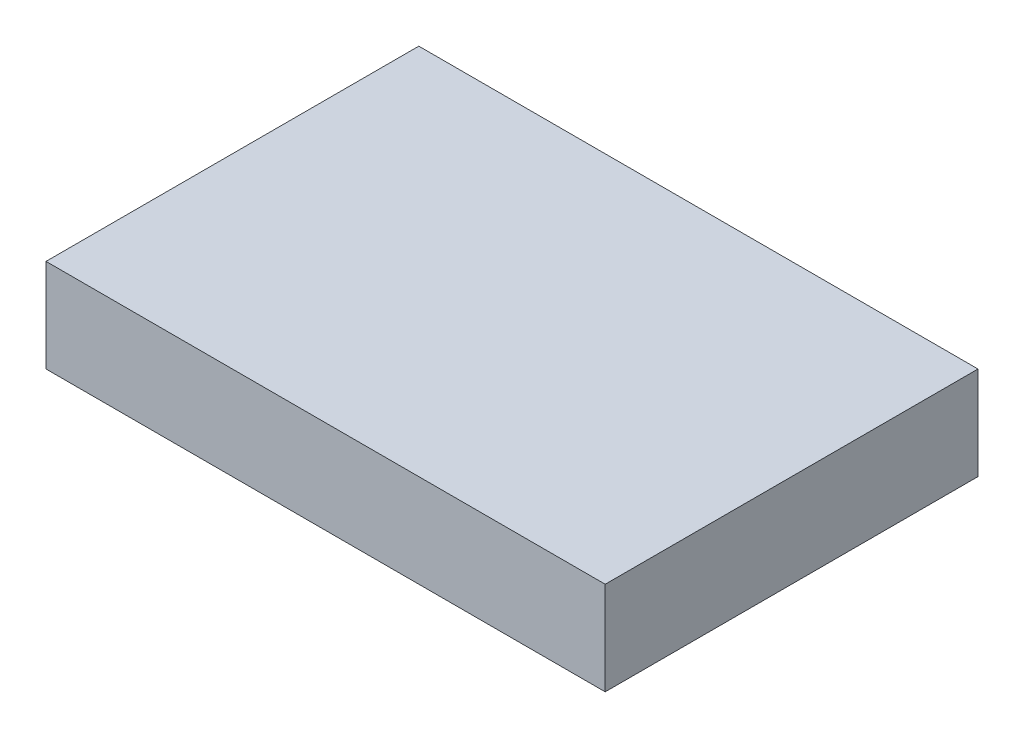
ISO-10303-21;
HEADER;
FILE_DESCRIPTION(('STEP AP214'),'2;1');
FILE_NAME('part.step','',(''),(''),'','','');
FILE_SCHEMA(('AUTOMOTIVE_DESIGN { 1 0 10303 214 1 1 1 1 }'));
ENDSEC;
DATA;
#1=APPLICATION_CONTEXT('core data for automotive mechanical design processes');
#2=APPLICATION_PROTOCOL_DEFINITION('international standard','automotive_design',2000,#1);
#3=PRODUCT_CONTEXT('',#1,'mechanical');
#4=PRODUCT('Part','Part','',(#3));
#5=PRODUCT_RELATED_PRODUCT_CATEGORY('part','',(#4));
#6=PRODUCT_DEFINITION_FORMATION('','',#4);
#7=PRODUCT_DEFINITION_CONTEXT('part definition',#1,'design');
#8=PRODUCT_DEFINITION('design','',#6,#7);
#9=PRODUCT_DEFINITION_SHAPE('','',#8);
#10=(LENGTH_UNIT() NAMED_UNIT(*) SI_UNIT(.MILLI.,.METRE.));
#11=(NAMED_UNIT(*) PLANE_ANGLE_UNIT() SI_UNIT($,.RADIAN.));
#12=(NAMED_UNIT(*) SI_UNIT($,.STERADIAN.) SOLID_ANGLE_UNIT());
#13=UNCERTAINTY_MEASURE_WITH_UNIT(LENGTH_MEASURE(1.E-05),#10,'distance_accuracy_value','');
#14=(GEOMETRIC_REPRESENTATION_CONTEXT(3) GLOBAL_UNCERTAINTY_ASSIGNED_CONTEXT((#13)) GLOBAL_UNIT_ASSIGNED_CONTEXT((#10,
#11,#12)) REPRESENTATION_CONTEXT('',''));
#15=CARTESIAN_POINT('',(0.,0.,0.));
#16=DIRECTION('',(0.,0.,1.));
#17=DIRECTION('',(1.,0.,0.));
#18=AXIS2_PLACEMENT_3D('',#15,#16,#17);
#19=CARTESIAN_POINT('',(0.,-12.7,0.));
#20=DIRECTION('',(-1.,0.,0.));
#21=DIRECTION('',(0.,0.,1.));
#22=AXIS2_PLACEMENT_3D('',#19,#20,#21);
#23=PLANE('',#22);
#24=DIRECTION('',(0.,0.,1.));
#25=VECTOR('',#24,1.);
#26=CARTESIAN_POINT('',(0.,0.,0.));
#27=LINE('',#26,#25);
#28=CARTESIAN_POINT('',(0.,0.,-50.8));
#29=VERTEX_POINT('',#28);
#30=CARTESIAN_POINT('',(0.,0.,0.));
#31=VERTEX_POINT('',#30);
#32=EDGE_CURVE('E95',#29,#31,#27,.T.);
#33=ORIENTED_EDGE('',*,*,#32,.F.);
#34=DIRECTION('',(0.,1.,0.));
#35=VECTOR('',#34,1.);
#36=CARTESIAN_POINT('',(0.,-12.7,-50.8));
#37=LINE('',#36,#35);
#38=CARTESIAN_POINT('',(0.,-12.7,-50.8));
#39=VERTEX_POINT('',#38);
#40=EDGE_CURVE('E11',#39,#29,#37,.T.);
#41=ORIENTED_EDGE('',*,*,#40,.F.);
#42=DIRECTION('',(0.,0.,1.));
#43=VECTOR('',#42,1.);
#44=CARTESIAN_POINT('',(0.,-12.7,0.));
#45=LINE('',#44,#43);
#46=CARTESIAN_POINT('',(0.,-12.7,0.));
#47=VERTEX_POINT('',#46);
#48=EDGE_CURVE('E89',#39,#47,#45,.T.);
#49=ORIENTED_EDGE('',*,*,#48,.T.);
#50=DIRECTION('',(0.,1.,0.));
#51=VECTOR('',#50,1.);
#52=CARTESIAN_POINT('',(0.,-12.7,0.));
#53=LINE('',#52,#51);
#54=EDGE_CURVE('E34',#47,#31,#53,.T.);
#55=ORIENTED_EDGE('',*,*,#54,.T.);
#56=EDGE_LOOP('',(#33,#41,#49,#55));
#57=FACE_BOUND('',#56,.T.);
#58=ADVANCED_FACE('F31',(#57),#23,.T.);
#59=CARTESIAN_POINT('',(0.,-12.7,-50.8));
#60=DIRECTION('',(0.,0.,-1.));
#61=DIRECTION('',(-1.,0.,0.));
#62=AXIS2_PLACEMENT_3D('',#59,#60,#61);
#63=PLANE('',#62);
#64=DIRECTION('',(-1.,0.,0.));
#65=VECTOR('',#64,1.);
#66=CARTESIAN_POINT('',(0.,0.,-50.8));
#67=LINE('',#66,#65);
#68=CARTESIAN_POINT('',(76.2,0.,-50.8));
#69=VERTEX_POINT('',#68);
#70=EDGE_CURVE('E91',#69,#29,#67,.T.);
#71=ORIENTED_EDGE('',*,*,#70,.F.);
#72=DIRECTION('',(0.,1.,0.));
#73=VECTOR('',#72,1.);
#74=CARTESIAN_POINT('',(76.2,-12.7,-50.8));
#75=LINE('',#74,#73);
#76=CARTESIAN_POINT('',(76.2,-12.7,-50.8));
#77=VERTEX_POINT('',#76);
#78=EDGE_CURVE('E40',#77,#69,#75,.T.);
#79=ORIENTED_EDGE('',*,*,#78,.F.);
#80=DIRECTION('',(-1.,0.,0.));
#81=VECTOR('',#80,1.);
#82=CARTESIAN_POINT('',(0.,-12.7,-50.8));
#83=LINE('',#82,#81);
#84=EDGE_CURVE('E86',#77,#39,#83,.T.);
#85=ORIENTED_EDGE('',*,*,#84,.T.);
#86=ORIENTED_EDGE('',*,*,#40,.T.);
#87=EDGE_LOOP('',(#71,#79,#85,#86));
#88=FACE_BOUND('',#87,.T.);
#89=ADVANCED_FACE('F105',(#88),#63,.T.);
#90=CARTESIAN_POINT('',(76.2,-12.7,0.));
#91=DIRECTION('',(1.,0.,0.));
#92=DIRECTION('',(0.,0.,-1.));
#93=AXIS2_PLACEMENT_3D('',#90,#91,#92);
#94=PLANE('',#93);
#95=DIRECTION('',(0.,0.,-1.));
#96=VECTOR('',#95,1.);
#97=CARTESIAN_POINT('',(76.2,0.,0.));
#98=LINE('',#97,#96);
#99=CARTESIAN_POINT('',(76.2,0.,0.));
#100=VERTEX_POINT('',#99);
#101=EDGE_CURVE('E81',#100,#69,#98,.T.);
#102=ORIENTED_EDGE('',*,*,#101,.F.);
#103=DIRECTION('',(0.,1.,0.));
#104=VECTOR('',#103,1.);
#105=CARTESIAN_POINT('',(76.2,-12.7,0.));
#106=LINE('',#105,#104);
#107=CARTESIAN_POINT('',(76.2,-12.7,0.));
#108=VERTEX_POINT('',#107);
#109=EDGE_CURVE('E76',#108,#100,#106,.T.);
#110=ORIENTED_EDGE('',*,*,#109,.F.);
#111=DIRECTION('',(0.,0.,-1.));
#112=VECTOR('',#111,1.);
#113=CARTESIAN_POINT('',(76.2,-12.7,0.));
#114=LINE('',#113,#112);
#115=EDGE_CURVE('E79',#108,#77,#114,.T.);
#116=ORIENTED_EDGE('',*,*,#115,.T.);
#117=ORIENTED_EDGE('',*,*,#78,.T.);
#118=EDGE_LOOP('',(#102,#110,#116,#117));
#119=FACE_BOUND('',#118,.T.);
#120=ADVANCED_FACE('F78',(#119),#94,.T.);
#121=CARTESIAN_POINT('',(0.,-12.7,0.));
#122=DIRECTION('',(0.,0.,1.));
#123=DIRECTION('',(1.,0.,0.));
#124=AXIS2_PLACEMENT_3D('',#121,#122,#123);
#125=PLANE('',#124);
#126=DIRECTION('',(1.,0.,0.));
#127=VECTOR('',#126,1.);
#128=CARTESIAN_POINT('',(0.,0.,0.));
#129=LINE('',#128,#127);
#130=EDGE_CURVE('E98',#31,#100,#129,.T.);
#131=ORIENTED_EDGE('',*,*,#130,.F.);
#132=ORIENTED_EDGE('',*,*,#54,.F.);
#133=DIRECTION('',(1.,0.,0.));
#134=VECTOR('',#133,1.);
#135=CARTESIAN_POINT('',(0.,-12.7,0.));
#136=LINE('',#135,#134);
#137=EDGE_CURVE('E85',#47,#108,#136,.T.);
#138=ORIENTED_EDGE('',*,*,#137,.T.);
#139=ORIENTED_EDGE('',*,*,#109,.T.);
#140=EDGE_LOOP('',(#131,#132,#138,#139));
#141=FACE_BOUND('',#140,.T.);
#142=ADVANCED_FACE('F88',(#141),#125,.T.);
#143=CARTESIAN_POINT('',(0.,-12.7,-50.8));
#144=DIRECTION('',(0.,-1.,0.));
#145=DIRECTION('',(0.,0.,-1.));
#146=AXIS2_PLACEMENT_3D('',#143,#144,#145);
#147=PLANE('',#146);
#148=ORIENTED_EDGE('',*,*,#48,.F.);
#149=ORIENTED_EDGE('',*,*,#84,.F.);
#150=ORIENTED_EDGE('',*,*,#115,.F.);
#151=ORIENTED_EDGE('',*,*,#137,.F.);
#152=EDGE_LOOP('',(#148,#149,#150,#151));
#153=FACE_BOUND('',#152,.T.);
#154=ADVANCED_FACE('F84',(#153),#147,.T.);
#155=CARTESIAN_POINT('',(0.,0.,-50.8));
#156=DIRECTION('',(0.,-1.,0.));
#157=DIRECTION('',(0.,0.,-1.));
#158=AXIS2_PLACEMENT_3D('',#155,#156,#157);
#159=PLANE('',#158);
#160=ORIENTED_EDGE('',*,*,#32,.T.);
#161=ORIENTED_EDGE('',*,*,#130,.T.);
#162=ORIENTED_EDGE('',*,*,#101,.T.);
#163=ORIENTED_EDGE('',*,*,#70,.T.);
#164=EDGE_LOOP('',(#160,#161,#162,#163));
#165=FACE_BOUND('',#164,.T.);
#166=ADVANCED_FACE('F104',(#165),#159,.F.);
#167=CLOSED_SHELL('',(#58,#89,#120,#142,#154,#166));
#168=MANIFOLD_SOLID_BREP('B2',#167);
#169=ADVANCED_BREP_SHAPE_REPRESENTATION('',(#18,#168),#14);
#170=SHAPE_DEFINITION_REPRESENTATION(#9,#169);
ENDSEC;
END-ISO-10303-21;
